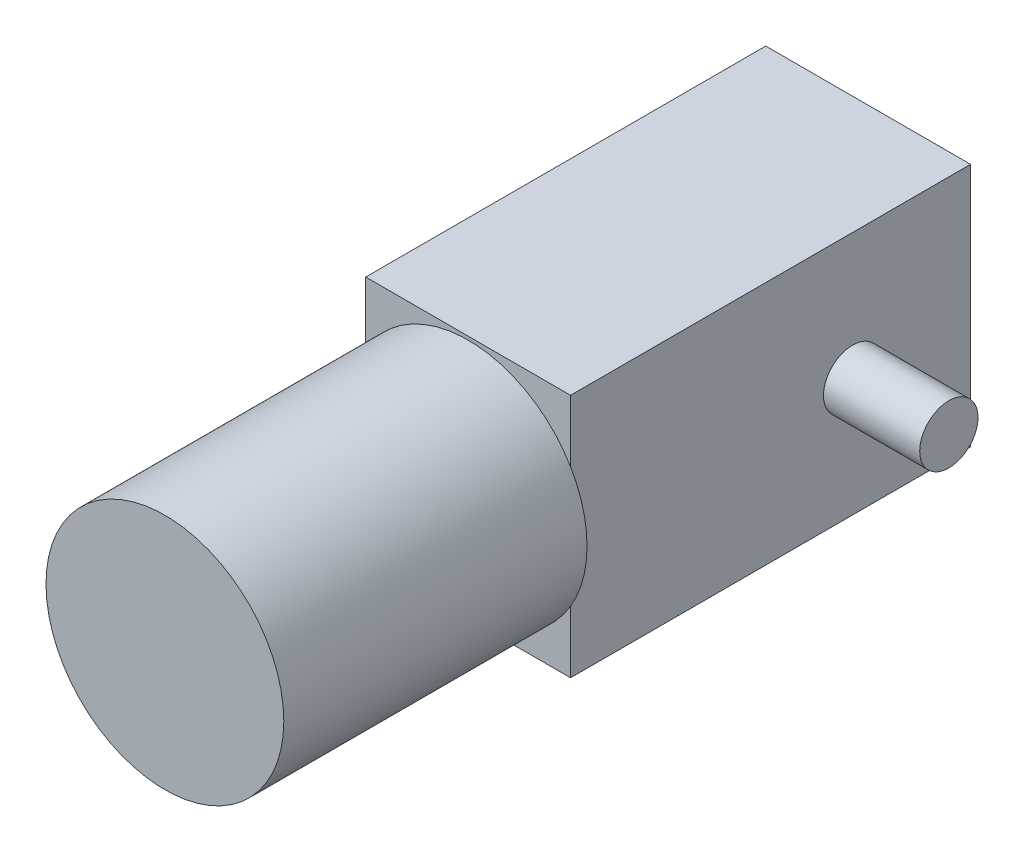
ISO-10303-21;
HEADER;
FILE_DESCRIPTION(('STEP AP214'),'2;1');
FILE_NAME('part.step','',(''),(''),'','','');
FILE_SCHEMA(('AUTOMOTIVE_DESIGN { 1 0 10303 214 1 1 1 1 }'));
ENDSEC;
DATA;
#1=APPLICATION_CONTEXT('core data for automotive mechanical design processes');
#2=APPLICATION_PROTOCOL_DEFINITION('international standard','automotive_design',2000,#1);
#3=PRODUCT_CONTEXT('',#1,'mechanical');
#4=PRODUCT('Part','Part','',(#3));
#5=PRODUCT_RELATED_PRODUCT_CATEGORY('part','',(#4));
#6=PRODUCT_DEFINITION_FORMATION('','',#4);
#7=PRODUCT_DEFINITION_CONTEXT('part definition',#1,'design');
#8=PRODUCT_DEFINITION('design','',#6,#7);
#9=PRODUCT_DEFINITION_SHAPE('','',#8);
#10=(LENGTH_UNIT() NAMED_UNIT(*) SI_UNIT(.MILLI.,.METRE.));
#11=(NAMED_UNIT(*) PLANE_ANGLE_UNIT() SI_UNIT($,.RADIAN.));
#12=(NAMED_UNIT(*) SI_UNIT($,.STERADIAN.) SOLID_ANGLE_UNIT());
#13=UNCERTAINTY_MEASURE_WITH_UNIT(LENGTH_MEASURE(1.E-05),#10,'distance_accuracy_value','');
#14=(GEOMETRIC_REPRESENTATION_CONTEXT(3) GLOBAL_UNCERTAINTY_ASSIGNED_CONTEXT((#13)) GLOBAL_UNIT_ASSIGNED_CONTEXT((#10,
#11,#12)) REPRESENTATION_CONTEXT('',''));
#15=CARTESIAN_POINT('',(0.,0.,0.));
#16=DIRECTION('',(0.,0.,1.));
#17=DIRECTION('',(1.,0.,0.));
#18=AXIS2_PLACEMENT_3D('',#15,#16,#17);
#19=CARTESIAN_POINT('',(0.,0.,36.957));
#20=DIRECTION('',(0.,0.,-1.));
#21=DIRECTION('',(-1.,0.,0.));
#22=AXIS2_PLACEMENT_3D('',#19,#20,#21);
#23=PLANE('',#22);
#24=CARTESIAN_POINT('',(9.4615,11.303,36.957));
#25=DIRECTION('',(0.,0.,1.));
#26=DIRECTION('',(1.,0.,0.));
#27=AXIS2_PLACEMENT_3D('',#24,#25,#26);
#28=CIRCLE('',#27,10.9855);
#29=CARTESIAN_POINT('',(18.923,16.8852242878623,36.957));
#30=VERTEX_POINT('',#29);
#31=CARTESIAN_POINT('',(0.,16.8852242878623,36.957));
#32=VERTEX_POINT('',#31);
#33=EDGE_CURVE('E149',#30,#32,#28,.T.);
#34=ORIENTED_EDGE('',*,*,#33,.F.);
#35=DIRECTION('',(0.,1.,0.));
#36=VECTOR('',#35,1.);
#37=CARTESIAN_POINT('',(18.923,0.,36.957));
#38=LINE('',#37,#36);
#39=CARTESIAN_POINT('',(18.923,22.606,36.957));
#40=VERTEX_POINT('',#39);
#41=EDGE_CURVE('E170',#30,#40,#38,.T.);
#42=ORIENTED_EDGE('',*,*,#41,.T.);
#43=DIRECTION('',(-1.,0.,0.));
#44=VECTOR('',#43,1.);
#45=CARTESIAN_POINT('',(0.,22.606,36.957));
#46=LINE('',#45,#44);
#47=CARTESIAN_POINT('',(0.,22.606,36.957));
#48=VERTEX_POINT('',#47);
#49=EDGE_CURVE('E174',#40,#48,#46,.T.);
#50=ORIENTED_EDGE('',*,*,#49,.T.);
#51=DIRECTION('',(0.,-1.,0.));
#52=VECTOR('',#51,1.);
#53=CARTESIAN_POINT('',(0.,0.,36.957));
#54=LINE('',#53,#52);
#55=EDGE_CURVE('E161',#48,#32,#54,.T.);
#56=ORIENTED_EDGE('',*,*,#55,.T.);
#57=EDGE_LOOP('',(#34,#42,#50,#56));
#58=FACE_BOUND('',#57,.T.);
#59=ADVANCED_FACE('F41',(#58),#23,.F.);
#60=CARTESIAN_POINT('',(0.,0.,36.957));
#61=DIRECTION('',(1.,0.,0.));
#62=DIRECTION('',(0.,0.,-1.));
#63=AXIS2_PLACEMENT_3D('',#60,#61,#62);
#64=PLANE('',#63);
#65=CARTESIAN_POINT('',(0.,10.8966,10.8966));
#66=DIRECTION('',(1.,0.,0.));
#67=DIRECTION('',(0.,0.,-1.));
#68=AXIS2_PLACEMENT_3D('',#65,#66,#67);
#69=CIRCLE('',#68,2.6924);
#70=CARTESIAN_POINT('',(0.,10.8966,8.2042));
#71=VERTEX_POINT('',#70);
#72=EDGE_CURVE('E452',#71,#71,#69,.T.);
#73=ORIENTED_EDGE('',*,*,#72,.T.);
#74=EDGE_LOOP('',(#73));
#75=FACE_BOUND('',#74,.T.);
#76=DIRECTION('',(0.,-1.,0.));
#77=VECTOR('',#76,1.);
#78=CARTESIAN_POINT('',(0.,0.,0.));
#79=LINE('',#78,#77);
#80=CARTESIAN_POINT('',(0.,22.606,0.));
#81=VERTEX_POINT('',#80);
#82=CARTESIAN_POINT('',(0.,0.,0.));
#83=VERTEX_POINT('',#82);
#84=EDGE_CURVE('E157',#81,#83,#79,.T.);
#85=ORIENTED_EDGE('',*,*,#84,.T.);
#86=DIRECTION('',(0.,0.,-1.));
#87=VECTOR('',#86,1.);
#88=CARTESIAN_POINT('',(0.,0.,36.957));
#89=LINE('',#88,#87);
#90=CARTESIAN_POINT('',(0.,0.,36.957));
#91=VERTEX_POINT('',#90);
#92=EDGE_CURVE('E201',#91,#83,#89,.T.);
#93=ORIENTED_EDGE('',*,*,#92,.F.);
#94=CARTESIAN_POINT('',(0.,5.72077571213767,36.957));
#95=VERTEX_POINT('',#94);
#96=EDGE_CURVE('E167',#95,#91,#54,.T.);
#97=ORIENTED_EDGE('',*,*,#96,.F.);
#98=EDGE_CURVE('E166',#32,#95,#54,.T.);
#99=ORIENTED_EDGE('',*,*,#98,.F.);
#100=ORIENTED_EDGE('',*,*,#55,.F.);
#101=DIRECTION('',(0.,0.,-1.));
#102=VECTOR('',#101,1.);
#103=CARTESIAN_POINT('',(0.,22.606,36.957));
#104=LINE('',#103,#102);
#105=EDGE_CURVE('E178',#48,#81,#104,.T.);
#106=ORIENTED_EDGE('',*,*,#105,.T.);
#107=EDGE_LOOP('',(#85,#93,#97,#99,#100,#106));
#108=FACE_BOUND('',#107,.T.);
#109=ADVANCED_FACE('F43',(#75,#108),#64,.F.);
#110=CARTESIAN_POINT('',(0.,0.,36.957));
#111=DIRECTION('',(0.,1.,0.));
#112=DIRECTION('',(0.,0.,1.));
#113=AXIS2_PLACEMENT_3D('',#110,#111,#112);
#114=PLANE('',#113);
#115=DIRECTION('',(1.,0.,0.));
#116=VECTOR('',#115,1.);
#117=CARTESIAN_POINT('',(0.,0.,0.));
#118=LINE('',#117,#116);
#119=CARTESIAN_POINT('',(18.923,0.,0.));
#120=VERTEX_POINT('',#119);
#121=EDGE_CURVE('E182',#83,#120,#118,.T.);
#122=ORIENTED_EDGE('',*,*,#121,.T.);
#123=DIRECTION('',(0.,0.,-1.));
#124=VECTOR('',#123,1.);
#125=CARTESIAN_POINT('',(18.923,0.,36.957));
#126=LINE('',#125,#124);
#127=CARTESIAN_POINT('',(18.923,0.,36.957));
#128=VERTEX_POINT('',#127);
#129=EDGE_CURVE('E198',#128,#120,#126,.T.);
#130=ORIENTED_EDGE('',*,*,#129,.F.);
#131=DIRECTION('',(1.,0.,0.));
#132=VECTOR('',#131,1.);
#133=CARTESIAN_POINT('',(0.,0.,36.957));
#134=LINE('',#133,#132);
#135=EDGE_CURVE('E165',#91,#128,#134,.T.);
#136=ORIENTED_EDGE('',*,*,#135,.F.);
#137=ORIENTED_EDGE('',*,*,#92,.T.);
#138=EDGE_LOOP('',(#122,#130,#136,#137));
#139=FACE_BOUND('',#138,.T.);
#140=ADVANCED_FACE('F225',(#139),#114,.F.);
#141=CARTESIAN_POINT('',(18.923,0.,36.957));
#142=DIRECTION('',(-1.,0.,0.));
#143=DIRECTION('',(0.,0.,1.));
#144=AXIS2_PLACEMENT_3D('',#141,#142,#143);
#145=PLANE('',#144);
#146=CARTESIAN_POINT('',(18.923,10.8966,10.8966));
#147=DIRECTION('',(-1.,0.,0.));
#148=DIRECTION('',(0.,0.,1.));
#149=AXIS2_PLACEMENT_3D('',#146,#147,#148);
#150=CIRCLE('',#149,2.6924);
#151=CARTESIAN_POINT('',(18.923,10.8966,13.589));
#152=VERTEX_POINT('',#151);
#153=EDGE_CURVE('E11',#152,#152,#150,.F.);
#154=ORIENTED_EDGE('',*,*,#153,.F.);
#155=EDGE_LOOP('',(#154));
#156=FACE_BOUND('',#155,.T.);
#157=DIRECTION('',(0.,1.,0.));
#158=VECTOR('',#157,1.);
#159=CARTESIAN_POINT('',(18.923,0.,0.));
#160=LINE('',#159,#158);
#161=CARTESIAN_POINT('',(18.923,22.606,0.));
#162=VERTEX_POINT('',#161);
#163=EDGE_CURVE('E185',#120,#162,#160,.T.);
#164=ORIENTED_EDGE('',*,*,#163,.T.);
#165=DIRECTION('',(0.,0.,-1.));
#166=VECTOR('',#165,1.);
#167=CARTESIAN_POINT('',(18.923,22.606,36.957));
#168=LINE('',#167,#166);
#169=EDGE_CURVE('E194',#40,#162,#168,.T.);
#170=ORIENTED_EDGE('',*,*,#169,.F.);
#171=ORIENTED_EDGE('',*,*,#41,.F.);
#172=CARTESIAN_POINT('',(18.923,5.72077571213767,36.957));
#173=VERTEX_POINT('',#172);
#174=EDGE_CURVE('E175',#173,#30,#38,.T.);
#175=ORIENTED_EDGE('',*,*,#174,.F.);
#176=EDGE_CURVE('E171',#128,#173,#38,.T.);
#177=ORIENTED_EDGE('',*,*,#176,.F.);
#178=ORIENTED_EDGE('',*,*,#129,.T.);
#179=EDGE_LOOP('',(#164,#170,#171,#175,#177,#178));
#180=FACE_BOUND('',#179,.T.);
#181=ADVANCED_FACE('F234',(#156,#180),#145,.F.);
#182=CARTESIAN_POINT('',(0.,22.606,36.957));
#183=DIRECTION('',(0.,-1.,0.));
#184=DIRECTION('',(0.,0.,-1.));
#185=AXIS2_PLACEMENT_3D('',#182,#183,#184);
#186=PLANE('',#185);
#187=DIRECTION('',(-1.,0.,0.));
#188=VECTOR('',#187,1.);
#189=CARTESIAN_POINT('',(0.,22.606,0.));
#190=LINE('',#189,#188);
#191=EDGE_CURVE('E188',#162,#81,#190,.T.);
#192=ORIENTED_EDGE('',*,*,#191,.T.);
#193=ORIENTED_EDGE('',*,*,#105,.F.);
#194=ORIENTED_EDGE('',*,*,#49,.F.);
#195=ORIENTED_EDGE('',*,*,#169,.T.);
#196=EDGE_LOOP('',(#192,#193,#194,#195));
#197=FACE_BOUND('',#196,.T.);
#198=ADVANCED_FACE('F262',(#197),#186,.F.);
#199=EDGE_CURVE('E50',#95,#173,#28,.T.);
#200=ORIENTED_EDGE('',*,*,#199,.F.);
#201=ORIENTED_EDGE('',*,*,#96,.T.);
#202=ORIENTED_EDGE('',*,*,#135,.T.);
#203=ORIENTED_EDGE('',*,*,#176,.T.);
#204=EDGE_LOOP('',(#200,#201,#202,#203));
#205=FACE_BOUND('',#204,.T.);
#206=ADVANCED_FACE('F223',(#205),#23,.F.);
#207=CARTESIAN_POINT('',(0.,0.,0.));
#208=DIRECTION('',(0.,0.,-1.));
#209=DIRECTION('',(-1.,0.,0.));
#210=AXIS2_PLACEMENT_3D('',#207,#208,#209);
#211=PLANE('',#210);
#212=DIRECTION('',(0.,-1.,0.));
#213=VECTOR('',#212,1.);
#214=CARTESIAN_POINT('',(10.8585,13.843,0.));
#215=LINE('',#214,#213);
#216=CARTESIAN_POINT('',(10.8585,13.843,0.));
#217=VERTEX_POINT('',#216);
#218=CARTESIAN_POINT('',(10.8585,8.76299999999999,0.));
#219=VERTEX_POINT('',#218);
#220=EDGE_CURVE('E57',#217,#219,#215,.T.);
#221=ORIENTED_EDGE('',*,*,#220,.F.);
#222=DIRECTION('',(1.,0.,0.));
#223=VECTOR('',#222,1.);
#224=CARTESIAN_POINT('',(10.8585,13.843,0.));
#225=LINE('',#224,#223);
#226=CARTESIAN_POINT('',(8.06449999999999,13.843,0.));
#227=VERTEX_POINT('',#226);
#228=EDGE_CURVE('E61',#227,#217,#225,.T.);
#229=ORIENTED_EDGE('',*,*,#228,.F.);
#230=DIRECTION('',(0.,1.,0.));
#231=VECTOR('',#230,1.);
#232=CARTESIAN_POINT('',(8.06449999999999,13.843,0.));
#233=LINE('',#232,#231);
#234=CARTESIAN_POINT('',(8.0645,8.76299999999999,0.));
#235=VERTEX_POINT('',#234);
#236=EDGE_CURVE('E427',#235,#227,#233,.T.);
#237=ORIENTED_EDGE('',*,*,#236,.F.);
#238=DIRECTION('',(-1.,0.,0.));
#239=VECTOR('',#238,1.);
#240=CARTESIAN_POINT('',(10.8585,8.76299999999999,0.));
#241=LINE('',#240,#239);
#242=EDGE_CURVE('E430',#219,#235,#241,.T.);
#243=ORIENTED_EDGE('',*,*,#242,.F.);
#244=EDGE_LOOP('',(#221,#229,#237,#243));
#245=FACE_BOUND('',#244,.T.);
#246=ORIENTED_EDGE('',*,*,#84,.F.);
#247=ORIENTED_EDGE('',*,*,#191,.F.);
#248=ORIENTED_EDGE('',*,*,#163,.F.);
#249=ORIENTED_EDGE('',*,*,#121,.F.);
#250=EDGE_LOOP('',(#246,#247,#248,#249));
#251=FACE_BOUND('',#250,.T.);
#252=ADVANCED_FACE('F231',(#245,#251),#211,.T.);
#253=CARTESIAN_POINT('',(9.4615,11.303,36.957));
#254=DIRECTION('',(0.,0.,1.));
#255=DIRECTION('',(1.,0.,0.));
#256=AXIS2_PLACEMENT_3D('',#253,#254,#255);
#257=PLANE('',#256);
#258=EDGE_CURVE('E147',#32,#95,#28,.T.);
#259=ORIENTED_EDGE('',*,*,#258,.F.);
#260=ORIENTED_EDGE('',*,*,#98,.T.);
#261=EDGE_LOOP('',(#259,#260));
#262=FACE_BOUND('',#261,.T.);
#263=ADVANCED_FACE('F216',(#262),#257,.F.);
#264=EDGE_CURVE('E142',#173,#30,#28,.T.);
#265=ORIENTED_EDGE('',*,*,#264,.F.);
#266=ORIENTED_EDGE('',*,*,#174,.T.);
#267=EDGE_LOOP('',(#265,#266));
#268=FACE_BOUND('',#267,.T.);
#269=ADVANCED_FACE('F242',(#268),#257,.F.);
#270=CARTESIAN_POINT('',(9.4615,11.303,64.9732));
#271=DIRECTION('',(0.,0.,-1.));
#272=DIRECTION('',(-1.,0.,0.));
#273=AXIS2_PLACEMENT_3D('',#270,#271,#272);
#274=CYLINDRICAL_SURFACE('',#273,10.9855);
#275=CARTESIAN_POINT('',(9.4615,11.303,64.9732));
#276=DIRECTION('',(0.,0.,1.));
#277=DIRECTION('',(1.,0.,0.));
#278=AXIS2_PLACEMENT_3D('',#275,#276,#277);
#279=CIRCLE('',#278,10.9855);
#280=CARTESIAN_POINT('',(20.447,11.303,64.9732));
#281=VERTEX_POINT('',#280);
#282=EDGE_CURVE('E154',#281,#281,#279,.T.);
#283=ORIENTED_EDGE('',*,*,#282,.F.);
#284=EDGE_LOOP('',(#283));
#285=FACE_BOUND('',#284,.T.);
#286=ORIENTED_EDGE('',*,*,#33,.T.);
#287=ORIENTED_EDGE('',*,*,#258,.T.);
#288=ORIENTED_EDGE('',*,*,#199,.T.);
#289=ORIENTED_EDGE('',*,*,#264,.T.);
#290=EDGE_LOOP('',(#286,#287,#288,#289));
#291=FACE_BOUND('',#290,.T.);
#292=ADVANCED_FACE('F213',(#285,#291),#274,.T.);
#293=CARTESIAN_POINT('',(9.4615,11.303,64.9732));
#294=DIRECTION('',(0.,0.,1.));
#295=DIRECTION('',(1.,0.,0.));
#296=AXIS2_PLACEMENT_3D('',#293,#294,#295);
#297=PLANE('',#296);
#298=ORIENTED_EDGE('',*,*,#282,.T.);
#299=EDGE_LOOP('',(#298));
#300=FACE_BOUND('',#299,.T.);
#301=ADVANCED_FACE('F249',(#300),#297,.T.);
#302=CARTESIAN_POINT('',(10.8585,13.843,-5.08));
#303=DIRECTION('',(-1.,0.,0.));
#304=DIRECTION('',(0.,0.,1.));
#305=AXIS2_PLACEMENT_3D('',#302,#303,#304);
#306=PLANE('',#305);
#307=ORIENTED_EDGE('',*,*,#220,.T.);
#308=DIRECTION('',(0.,0.,1.));
#309=VECTOR('',#308,1.);
#310=CARTESIAN_POINT('',(10.8585,8.76299999999999,-5.08));
#311=LINE('',#310,#309);
#312=CARTESIAN_POINT('',(10.8585,8.76299999999999,-5.08));
#313=VERTEX_POINT('',#312);
#314=EDGE_CURVE('E122',#313,#219,#311,.T.);
#315=ORIENTED_EDGE('',*,*,#314,.F.);
#316=DIRECTION('',(0.,-1.,0.));
#317=VECTOR('',#316,1.);
#318=CARTESIAN_POINT('',(10.8585,13.843,-5.08));
#319=LINE('',#318,#317);
#320=CARTESIAN_POINT('',(10.8585,13.843,-5.08));
#321=VERTEX_POINT('',#320);
#322=EDGE_CURVE('E129',#321,#313,#319,.T.);
#323=ORIENTED_EDGE('',*,*,#322,.F.);
#324=DIRECTION('',(0.,0.,1.));
#325=VECTOR('',#324,1.);
#326=CARTESIAN_POINT('',(10.8585,13.843,-5.08));
#327=LINE('',#326,#325);
#328=EDGE_CURVE('E433',#321,#217,#327,.T.);
#329=ORIENTED_EDGE('',*,*,#328,.T.);
#330=EDGE_LOOP('',(#307,#315,#323,#329));
#331=FACE_BOUND('',#330,.T.);
#332=ADVANCED_FACE('F140',(#331),#306,.F.);
#333=CARTESIAN_POINT('',(10.8585,8.76299999999999,-5.08));
#334=DIRECTION('',(0.,1.,0.));
#335=DIRECTION('',(0.,0.,1.));
#336=AXIS2_PLACEMENT_3D('',#333,#334,#335);
#337=PLANE('',#336);
#338=ORIENTED_EDGE('',*,*,#242,.T.);
#339=DIRECTION('',(0.,0.,1.));
#340=VECTOR('',#339,1.);
#341=CARTESIAN_POINT('',(8.0645,8.76299999999999,-5.08));
#342=LINE('',#341,#340);
#343=CARTESIAN_POINT('',(8.0645,8.76299999999999,-5.08));
#344=VERTEX_POINT('',#343);
#345=EDGE_CURVE('E124',#344,#235,#342,.T.);
#346=ORIENTED_EDGE('',*,*,#345,.F.);
#347=DIRECTION('',(-1.,0.,0.));
#348=VECTOR('',#347,1.);
#349=CARTESIAN_POINT('',(10.8585,8.76299999999999,-5.08));
#350=LINE('',#349,#348);
#351=EDGE_CURVE('E117',#313,#344,#350,.T.);
#352=ORIENTED_EDGE('',*,*,#351,.F.);
#353=ORIENTED_EDGE('',*,*,#314,.T.);
#354=EDGE_LOOP('',(#338,#346,#352,#353));
#355=FACE_BOUND('',#354,.T.);
#356=ADVANCED_FACE('F120',(#355),#337,.F.);
#357=CARTESIAN_POINT('',(8.06449999999999,13.843,-5.08));
#358=DIRECTION('',(1.,0.,0.));
#359=DIRECTION('',(0.,1.,0.));
#360=AXIS2_PLACEMENT_3D('',#357,#358,#359);
#361=PLANE('',#360);
#362=ORIENTED_EDGE('',*,*,#236,.T.);
#363=DIRECTION('',(0.,0.,1.));
#364=VECTOR('',#363,1.);
#365=CARTESIAN_POINT('',(8.06449999999999,13.843,-5.08));
#366=LINE('',#365,#364);
#367=CARTESIAN_POINT('',(8.06449999999999,13.843,-5.08));
#368=VERTEX_POINT('',#367);
#369=EDGE_CURVE('E150',#368,#227,#366,.T.);
#370=ORIENTED_EDGE('',*,*,#369,.F.);
#371=DIRECTION('',(0.,1.,0.));
#372=VECTOR('',#371,1.);
#373=CARTESIAN_POINT('',(8.06449999999999,13.843,-5.08));
#374=LINE('',#373,#372);
#375=EDGE_CURVE('E128',#344,#368,#374,.T.);
#376=ORIENTED_EDGE('',*,*,#375,.F.);
#377=ORIENTED_EDGE('',*,*,#345,.T.);
#378=EDGE_LOOP('',(#362,#370,#376,#377));
#379=FACE_BOUND('',#378,.T.);
#380=ADVANCED_FACE('F351',(#379),#361,.F.);
#381=CARTESIAN_POINT('',(10.8585,13.843,-5.08));
#382=DIRECTION('',(0.,-1.,0.));
#383=DIRECTION('',(0.,0.,-1.));
#384=AXIS2_PLACEMENT_3D('',#381,#382,#383);
#385=PLANE('',#384);
#386=ORIENTED_EDGE('',*,*,#228,.T.);
#387=ORIENTED_EDGE('',*,*,#328,.F.);
#388=DIRECTION('',(1.,0.,0.));
#389=VECTOR('',#388,1.);
#390=CARTESIAN_POINT('',(10.8585,13.843,-5.08));
#391=LINE('',#390,#389);
#392=EDGE_CURVE('E134',#368,#321,#391,.T.);
#393=ORIENTED_EDGE('',*,*,#392,.F.);
#394=ORIENTED_EDGE('',*,*,#369,.T.);
#395=EDGE_LOOP('',(#386,#387,#393,#394));
#396=FACE_BOUND('',#395,.T.);
#397=ADVANCED_FACE('F347',(#396),#385,.F.);
#398=CARTESIAN_POINT('',(0.,0.,-5.08));
#399=DIRECTION('',(0.,0.,-1.));
#400=DIRECTION('',(-1.,0.,0.));
#401=AXIS2_PLACEMENT_3D('',#398,#399,#400);
#402=PLANE('',#401);
#403=ORIENTED_EDGE('',*,*,#322,.T.);
#404=ORIENTED_EDGE('',*,*,#351,.T.);
#405=ORIENTED_EDGE('',*,*,#375,.T.);
#406=ORIENTED_EDGE('',*,*,#392,.T.);
#407=EDGE_LOOP('',(#403,#404,#405,#406));
#408=FACE_BOUND('',#407,.T.);
#409=ADVANCED_FACE('F132',(#408),#402,.T.);
#410=CARTESIAN_POINT('',(27.813,10.8966,10.8966));
#411=DIRECTION('',(-1.,0.,0.));
#412=DIRECTION('',(0.,0.,1.));
#413=AXIS2_PLACEMENT_3D('',#410,#411,#412);
#414=CYLINDRICAL_SURFACE('',#413,2.6924);
#415=CARTESIAN_POINT('',(27.813,10.8966,10.8966));
#416=DIRECTION('',(1.,0.,0.));
#417=DIRECTION('',(0.,0.,-1.));
#418=AXIS2_PLACEMENT_3D('',#415,#416,#417);
#419=CIRCLE('',#418,2.6924);
#420=CARTESIAN_POINT('',(27.813,10.8966,8.2042));
#421=VERTEX_POINT('',#420);
#422=EDGE_CURVE('E443',#421,#421,#419,.T.);
#423=ORIENTED_EDGE('',*,*,#422,.F.);
#424=EDGE_LOOP('',(#423));
#425=FACE_BOUND('',#424,.T.);
#426=ORIENTED_EDGE('',*,*,#153,.T.);
#427=EDGE_LOOP('',(#426));
#428=FACE_BOUND('',#427,.T.);
#429=ADVANCED_FACE('F294',(#425,#428),#414,.T.);
#430=CARTESIAN_POINT('',(27.813,10.8966,10.8966));
#431=DIRECTION('',(1.,0.,0.));
#432=DIRECTION('',(0.,0.,-1.));
#433=AXIS2_PLACEMENT_3D('',#430,#431,#432);
#434=PLANE('',#433);
#435=ORIENTED_EDGE('',*,*,#422,.T.);
#436=EDGE_LOOP('',(#435));
#437=FACE_BOUND('',#436,.T.);
#438=ADVANCED_FACE('F300',(#437),#434,.T.);
#439=CARTESIAN_POINT('',(-8.89,10.8966,10.8966));
#440=DIRECTION('',(1.,0.,0.));
#441=DIRECTION('',(0.,0.,-1.));
#442=AXIS2_PLACEMENT_3D('',#439,#440,#441);
#443=CYLINDRICAL_SURFACE('',#442,2.6924);
#444=CARTESIAN_POINT('',(-8.89,10.8966,10.8966));
#445=DIRECTION('',(1.,0.,0.));
#446=DIRECTION('',(0.,0.,-1.));
#447=AXIS2_PLACEMENT_3D('',#444,#445,#446);
#448=CIRCLE('',#447,2.6924);
#449=CARTESIAN_POINT('',(-8.89,10.8966,8.2042));
#450=VERTEX_POINT('',#449);
#451=EDGE_CURVE('E451',#450,#450,#448,.T.);
#452=ORIENTED_EDGE('',*,*,#451,.T.);
#453=EDGE_LOOP('',(#452));
#454=FACE_BOUND('',#453,.T.);
#455=ORIENTED_EDGE('',*,*,#72,.F.);
#456=EDGE_LOOP('',(#455));
#457=FACE_BOUND('',#456,.T.);
#458=ADVANCED_FACE('F311',(#454,#457),#443,.T.);
#459=CARTESIAN_POINT('',(-8.89,10.8966,10.8966));
#460=DIRECTION('',(-1.,0.,0.));
#461=DIRECTION('',(0.,0.,-1.));
#462=AXIS2_PLACEMENT_3D('',#459,#460,#461);
#463=PLANE('',#462);
#464=ORIENTED_EDGE('',*,*,#451,.F.);
#465=EDGE_LOOP('',(#464));
#466=FACE_BOUND('',#465,.T.);
#467=ADVANCED_FACE('F327',(#466),#463,.T.);
#468=CLOSED_SHELL('',(#59,#109,#140,#181,#198,#206,#252,#263,#269,#292,#301,#332,#356,#380,#397,
#409,#429,#438,#458,#467));
#469=MANIFOLD_SOLID_BREP('B2',#468);
#470=ADVANCED_BREP_SHAPE_REPRESENTATION('',(#18,#469),#14);
#471=SHAPE_DEFINITION_REPRESENTATION(#9,#470);
ENDSEC;
END-ISO-10303-21;
